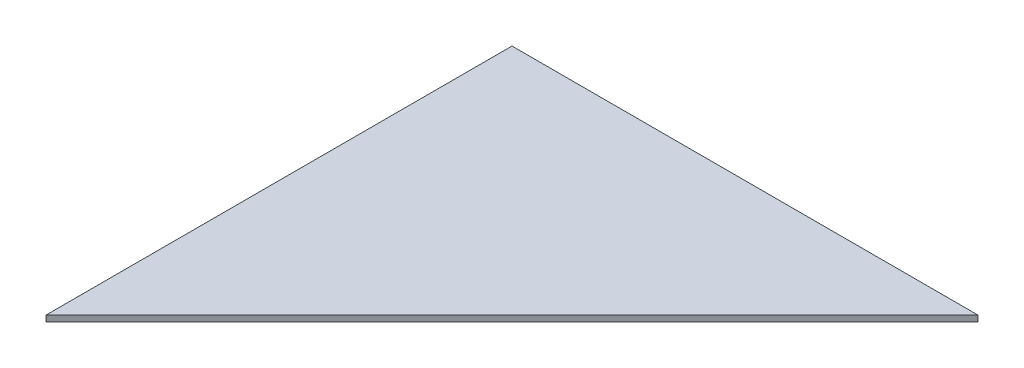
ISO-10303-21;
HEADER;
FILE_DESCRIPTION(('STEP AP214'),'2;1');
FILE_NAME('part.step','',(''),(''),'','','');
FILE_SCHEMA(('AUTOMOTIVE_DESIGN { 1 0 10303 214 1 1 1 1 }'));
ENDSEC;
DATA;
#1=APPLICATION_CONTEXT('core data for automotive mechanical design processes');
#2=APPLICATION_PROTOCOL_DEFINITION('international standard','automotive_design',2000,#1);
#3=PRODUCT_CONTEXT('',#1,'mechanical');
#4=PRODUCT('Part','Part','',(#3));
#5=PRODUCT_RELATED_PRODUCT_CATEGORY('part','',(#4));
#6=PRODUCT_DEFINITION_FORMATION('','',#4);
#7=PRODUCT_DEFINITION_CONTEXT('part definition',#1,'design');
#8=PRODUCT_DEFINITION('design','',#6,#7);
#9=PRODUCT_DEFINITION_SHAPE('','',#8);
#10=(LENGTH_UNIT() NAMED_UNIT(*) SI_UNIT(.MILLI.,.METRE.));
#11=(NAMED_UNIT(*) PLANE_ANGLE_UNIT() SI_UNIT($,.RADIAN.));
#12=(NAMED_UNIT(*) SI_UNIT($,.STERADIAN.) SOLID_ANGLE_UNIT());
#13=UNCERTAINTY_MEASURE_WITH_UNIT(LENGTH_MEASURE(1.E-05),#10,'distance_accuracy_value','');
#14=(GEOMETRIC_REPRESENTATION_CONTEXT(3) GLOBAL_UNCERTAINTY_ASSIGNED_CONTEXT((#13)) GLOBAL_UNIT_ASSIGNED_CONTEXT((#10,
#11,#12)) REPRESENTATION_CONTEXT('',''));
#15=CARTESIAN_POINT('',(0.,0.,0.));
#16=DIRECTION('',(0.,0.,1.));
#17=DIRECTION('',(1.,0.,0.));
#18=AXIS2_PLACEMENT_3D('',#15,#16,#17);
#19=CARTESIAN_POINT('',(86.5,28.,0.));
#20=DIRECTION('',(0.,0.,1.));
#21=DIRECTION('',(1.,0.,0.));
#22=AXIS2_PLACEMENT_3D('',#19,#20,#21);
#23=PLANE('',#22);
#24=DIRECTION('',(-1.,0.,0.));
#25=VECTOR('',#24,1.);
#26=CARTESIAN_POINT('',(86.5,27.,0.));
#27=LINE('',#26,#25);
#28=CARTESIAN_POINT('',(86.5,27.,0.));
#29=VERTEX_POINT('',#28);
#30=CARTESIAN_POINT('',(8.5,27.,0.));
#31=VERTEX_POINT('',#30);
#32=EDGE_CURVE('E127',#29,#31,#27,.T.);
#33=ORIENTED_EDGE('',*,*,#32,.T.);
#34=DIRECTION('',(0.,-1.,0.));
#35=VECTOR('',#34,1.);
#36=CARTESIAN_POINT('',(8.5,28.,0.));
#37=LINE('',#36,#35);
#38=CARTESIAN_POINT('',(8.5,28.,0.));
#39=VERTEX_POINT('',#38);
#40=EDGE_CURVE('E12',#39,#31,#37,.T.);
#41=ORIENTED_EDGE('',*,*,#40,.F.);
#42=DIRECTION('',(-1.,0.,0.));
#43=VECTOR('',#42,1.);
#44=CARTESIAN_POINT('',(86.5,28.,0.));
#45=LINE('',#44,#43);
#46=CARTESIAN_POINT('',(86.5,28.,0.));
#47=VERTEX_POINT('',#46);
#48=EDGE_CURVE('E120',#47,#39,#45,.T.);
#49=ORIENTED_EDGE('',*,*,#48,.F.);
#50=DIRECTION('',(0.,-1.,0.));
#51=VECTOR('',#50,1.);
#52=CARTESIAN_POINT('',(86.5,28.,0.));
#53=LINE('',#52,#51);
#54=EDGE_CURVE('E128',#47,#29,#53,.T.);
#55=ORIENTED_EDGE('',*,*,#54,.T.);
#56=EDGE_LOOP('',(#33,#41,#49,#55));
#57=FACE_BOUND('',#56,.T.);
#58=ADVANCED_FACE('F80',(#57),#23,.F.);
#59=CARTESIAN_POINT('',(8.5,28.,0.));
#60=DIRECTION('',(1.,0.,0.));
#61=DIRECTION('',(0.,1.,0.));
#62=AXIS2_PLACEMENT_3D('',#59,#60,#61);
#63=PLANE('',#62);
#64=DIRECTION('',(0.,0.,1.));
#65=VECTOR('',#64,1.);
#66=CARTESIAN_POINT('',(8.5,27.,0.));
#67=LINE('',#66,#65);
#68=CARTESIAN_POINT('',(8.5,27.,78.0000000000007));
#69=VERTEX_POINT('',#68);
#70=EDGE_CURVE('E108',#31,#69,#67,.T.);
#71=ORIENTED_EDGE('',*,*,#70,.T.);
#72=DIRECTION('',(0.,-1.,0.));
#73=VECTOR('',#72,1.);
#74=CARTESIAN_POINT('',(8.5,28.,78.0000000000007));
#75=LINE('',#74,#73);
#76=CARTESIAN_POINT('',(8.5,28.,78.0000000000007));
#77=VERTEX_POINT('',#76);
#78=EDGE_CURVE('E88',#77,#69,#75,.T.);
#79=ORIENTED_EDGE('',*,*,#78,.F.);
#80=DIRECTION('',(0.,0.,1.));
#81=VECTOR('',#80,1.);
#82=CARTESIAN_POINT('',(8.5,28.,0.));
#83=LINE('',#82,#81);
#84=EDGE_CURVE('E116',#39,#77,#83,.T.);
#85=ORIENTED_EDGE('',*,*,#84,.F.);
#86=ORIENTED_EDGE('',*,*,#40,.T.);
#87=EDGE_LOOP('',(#71,#79,#85,#86));
#88=FACE_BOUND('',#87,.T.);
#89=ADVANCED_FACE('F117',(#88),#63,.F.);
#90=CARTESIAN_POINT('',(8.5,28.,78.0000000000007));
#91=DIRECTION('',(-0.707106781186551,0.,-0.707106781186544));
#92=DIRECTION('',(-0.707106781186544,0.,0.707106781186551));
#93=AXIS2_PLACEMENT_3D('',#90,#91,#92);
#94=PLANE('',#93);
#95=DIRECTION('',(0.707106781186544,0.,-0.707106781186551));
#96=VECTOR('',#95,1.);
#97=CARTESIAN_POINT('',(8.5,27.,78.0000000000007));
#98=LINE('',#97,#96);
#99=EDGE_CURVE('E113',#69,#29,#98,.T.);
#100=ORIENTED_EDGE('',*,*,#99,.T.);
#101=ORIENTED_EDGE('',*,*,#54,.F.);
#102=DIRECTION('',(0.707106781186544,0.,-0.707106781186551));
#103=VECTOR('',#102,1.);
#104=CARTESIAN_POINT('',(8.5,28.,78.0000000000007));
#105=LINE('',#104,#103);
#106=EDGE_CURVE('E96',#77,#47,#105,.T.);
#107=ORIENTED_EDGE('',*,*,#106,.F.);
#108=ORIENTED_EDGE('',*,*,#78,.T.);
#109=EDGE_LOOP('',(#100,#101,#107,#108));
#110=FACE_BOUND('',#109,.T.);
#111=ADVANCED_FACE('F135',(#110),#94,.F.);
#112=CARTESIAN_POINT('',(0.,28.,0.));
#113=DIRECTION('',(0.,1.,0.));
#114=DIRECTION('',(-1.,0.,0.));
#115=AXIS2_PLACEMENT_3D('',#112,#113,#114);
#116=PLANE('',#115);
#117=ORIENTED_EDGE('',*,*,#48,.T.);
#118=ORIENTED_EDGE('',*,*,#84,.T.);
#119=ORIENTED_EDGE('',*,*,#106,.T.);
#120=EDGE_LOOP('',(#117,#118,#119));
#121=FACE_BOUND('',#120,.T.);
#122=ADVANCED_FACE('F123',(#121),#116,.T.);
#123=CARTESIAN_POINT('',(0.,27.,0.));
#124=DIRECTION('',(0.,1.,0.));
#125=DIRECTION('',(-1.,0.,0.));
#126=AXIS2_PLACEMENT_3D('',#123,#124,#125);
#127=PLANE('',#126);
#128=ORIENTED_EDGE('',*,*,#32,.F.);
#129=ORIENTED_EDGE('',*,*,#99,.F.);
#130=ORIENTED_EDGE('',*,*,#70,.F.);
#131=EDGE_LOOP('',(#128,#129,#130));
#132=FACE_BOUND('',#131,.T.);
#133=ADVANCED_FACE('F136',(#132),#127,.F.);
#134=CLOSED_SHELL('',(#58,#89,#111,#122,#133));
#135=MANIFOLD_SOLID_BREP('B2',#134);
#136=ADVANCED_BREP_SHAPE_REPRESENTATION('',(#18,#135),#14);
#137=SHAPE_DEFINITION_REPRESENTATION(#9,#136);
ENDSEC;
END-ISO-10303-21;
